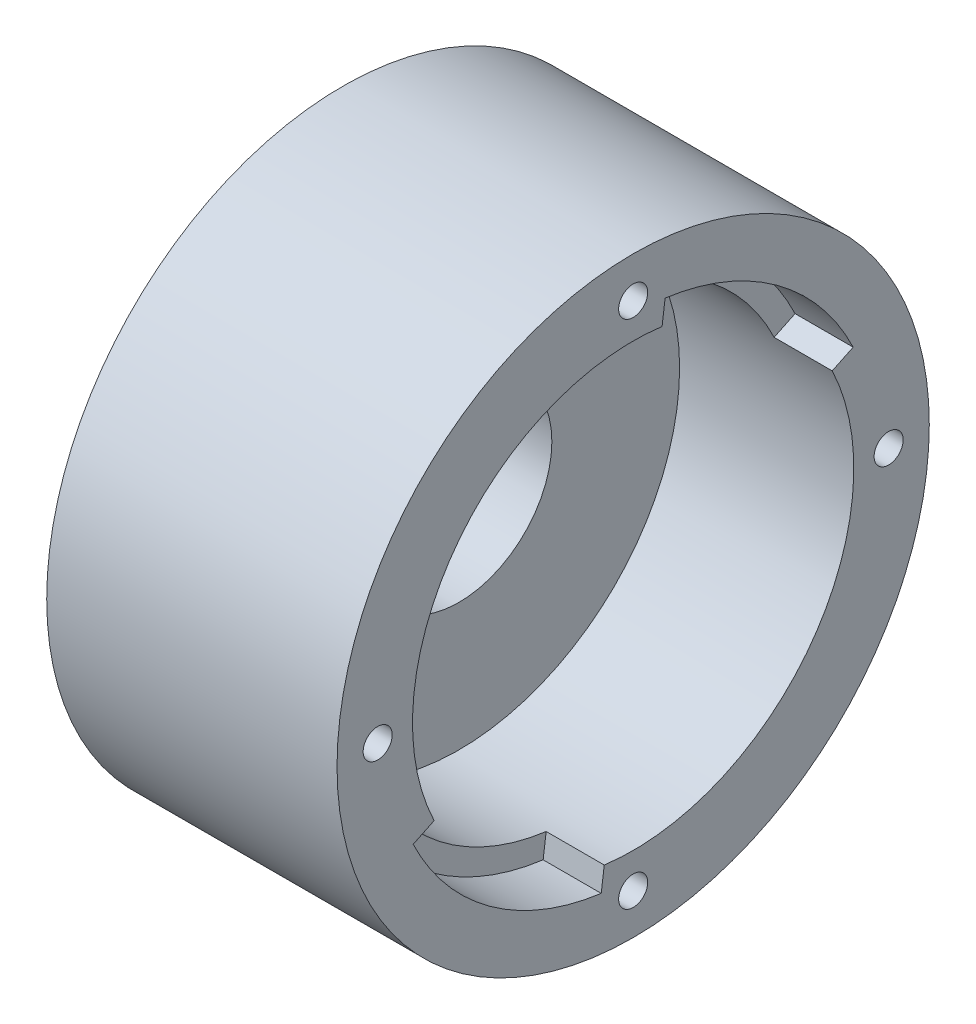
ISO-10303-21;
HEADER;
FILE_DESCRIPTION(('STEP AP214'),'2;1');
FILE_NAME('part.step','',(''),(''),'','','');
FILE_SCHEMA(('AUTOMOTIVE_DESIGN { 1 0 10303 214 1 1 1 1 }'));
ENDSEC;
DATA;
#1=APPLICATION_CONTEXT('core data for automotive mechanical design processes');
#2=APPLICATION_PROTOCOL_DEFINITION('international standard','automotive_design',2000,#1);
#3=PRODUCT_CONTEXT('',#1,'mechanical');
#4=PRODUCT('Part','Part','',(#3));
#5=PRODUCT_RELATED_PRODUCT_CATEGORY('part','',(#4));
#6=PRODUCT_DEFINITION_FORMATION('','',#4);
#7=PRODUCT_DEFINITION_CONTEXT('part definition',#1,'design');
#8=PRODUCT_DEFINITION('design','',#6,#7);
#9=PRODUCT_DEFINITION_SHAPE('','',#8);
#10=(LENGTH_UNIT() NAMED_UNIT(*) SI_UNIT(.MILLI.,.METRE.));
#11=(NAMED_UNIT(*) PLANE_ANGLE_UNIT() SI_UNIT($,.RADIAN.));
#12=(NAMED_UNIT(*) SI_UNIT($,.STERADIAN.) SOLID_ANGLE_UNIT());
#13=UNCERTAINTY_MEASURE_WITH_UNIT(LENGTH_MEASURE(1.E-05),#10,'distance_accuracy_value','');
#14=(GEOMETRIC_REPRESENTATION_CONTEXT(3) GLOBAL_UNCERTAINTY_ASSIGNED_CONTEXT((#13)) GLOBAL_UNIT_ASSIGNED_CONTEXT((#10,
#11,#12)) REPRESENTATION_CONTEXT('',''));
#15=CARTESIAN_POINT('',(0.,0.,0.));
#16=DIRECTION('',(0.,0.,1.));
#17=DIRECTION('',(1.,0.,0.));
#18=AXIS2_PLACEMENT_3D('',#15,#16,#17);
#19=CARTESIAN_POINT('',(163.98,0.,0.));
#20=DIRECTION('',(1.,0.,0.));
#21=DIRECTION('',(0.,0.,-1.));
#22=AXIS2_PLACEMENT_3D('',#19,#20,#21);
#23=CYLINDRICAL_SURFACE('',#22,16.);
#24=CARTESIAN_POINT('',(163.98,0.,0.));
#25=DIRECTION('',(-1.,0.,0.));
#26=DIRECTION('',(0.,0.,1.));
#27=AXIS2_PLACEMENT_3D('',#24,#25,#26);
#28=CIRCLE('',#27,16.);
#29=CARTESIAN_POINT('',(163.98,0.,16.));
#30=VERTEX_POINT('',#29);
#31=EDGE_CURVE('E276',#30,#30,#28,.T.);
#32=ORIENTED_EDGE('',*,*,#31,.T.);
#33=EDGE_LOOP('',(#32));
#34=FACE_BOUND('',#33,.T.);
#35=CARTESIAN_POINT('',(183.98,0.,0.));
#36=DIRECTION('',(1.,0.,0.));
#37=DIRECTION('',(0.,0.,-1.));
#38=AXIS2_PLACEMENT_3D('',#35,#36,#37);
#39=CIRCLE('',#38,16.);
#40=CARTESIAN_POINT('',(183.98,0.,-16.));
#41=VERTEX_POINT('',#40);
#42=EDGE_CURVE('E45',#41,#41,#39,.T.);
#43=ORIENTED_EDGE('',*,*,#42,.T.);
#44=EDGE_LOOP('',(#43));
#45=FACE_BOUND('',#44,.T.);
#46=ADVANCED_FACE('F41',(#34,#45),#23,.F.);
#47=CARTESIAN_POINT('',(203.98,0.,0.));
#48=DIRECTION('',(1.,0.,0.));
#49=DIRECTION('',(0.,0.,-1.));
#50=AXIS2_PLACEMENT_3D('',#47,#48,#49);
#51=CYLINDRICAL_SURFACE('',#50,42.);
#52=CARTESIAN_POINT('',(213.98,0.,0.));
#53=DIRECTION('',(1.,0.,0.));
#54=DIRECTION('',(0.,0.,1.));
#55=AXIS2_PLACEMENT_3D('',#52,#53,#54);
#56=CIRCLE('',#55,42.);
#57=CARTESIAN_POINT('',(213.98,18.1283380226099,-37.886189575332));
#58=VERTEX_POINT('',#57);
#59=CARTESIAN_POINT('',(213.98,41.6379057132109,-5.50316343731083));
#60=VERTEX_POINT('',#59);
#61=EDGE_CURVE('E114',#58,#60,#56,.T.);
#62=ORIENTED_EDGE('',*,*,#61,.T.);
#63=DIRECTION('',(1.,0.,0.));
#64=VECTOR('',#63,1.);
#65=CARTESIAN_POINT('',(203.98,41.6379057132109,-5.50316343731083));
#66=LINE('',#65,#64);
#67=CARTESIAN_POINT('',(203.98,41.6379057132109,-5.50316343731083));
#68=VERTEX_POINT('',#67);
#69=EDGE_CURVE('E109',#68,#60,#66,.T.);
#70=ORIENTED_EDGE('',*,*,#69,.F.);
#71=CARTESIAN_POINT('',(203.98,0.,0.));
#72=DIRECTION('',(1.,0.,0.));
#73=DIRECTION('',(0.,0.,-1.));
#74=AXIS2_PLACEMENT_3D('',#71,#72,#73);
#75=CIRCLE('',#74,42.);
#76=CARTESIAN_POINT('',(203.98,18.1283380226099,-37.886189575332));
#77=VERTEX_POINT('',#76);
#78=EDGE_CURVE('E111',#77,#68,#75,.T.);
#79=ORIENTED_EDGE('',*,*,#78,.F.);
#80=DIRECTION('',(1.,0.,0.));
#81=VECTOR('',#80,1.);
#82=CARTESIAN_POINT('',(203.98,18.1283380226099,-37.886189575332));
#83=LINE('',#82,#81);
#84=EDGE_CURVE('E150',#77,#58,#83,.T.);
#85=ORIENTED_EDGE('',*,*,#84,.T.);
#86=EDGE_LOOP('',(#62,#70,#79,#85));
#87=FACE_BOUND('',#86,.T.);
#88=ADVANCED_FACE('F110',(#87),#51,.F.);
#89=CARTESIAN_POINT('',(203.98,0.,0.));
#90=DIRECTION('',(1.,0.,0.));
#91=DIRECTION('',(0.,0.,-1.));
#92=AXIS2_PLACEMENT_3D('',#89,#90,#91);
#93=CYLINDRICAL_SURFACE('',#92,42.);
#94=CARTESIAN_POINT('',(213.98,0.,0.));
#95=DIRECTION('',(1.,0.,0.));
#96=DIRECTION('',(0.,0.,1.));
#97=AXIS2_PLACEMENT_3D('',#94,#95,#96);
#98=CIRCLE('',#97,42.);
#99=CARTESIAN_POINT('',(213.98,-18.1283380226064,37.8861895753337));
#100=VERTEX_POINT('',#99);
#101=CARTESIAN_POINT('',(213.98,-41.6379057132105,5.50316343731468));
#102=VERTEX_POINT('',#101);
#103=EDGE_CURVE('E162',#100,#102,#98,.T.);
#104=ORIENTED_EDGE('',*,*,#103,.T.);
#105=DIRECTION('',(1.,0.,0.));
#106=VECTOR('',#105,1.);
#107=CARTESIAN_POINT('',(203.98,-41.6379057132105,5.50316343731468));
#108=LINE('',#107,#106);
#109=CARTESIAN_POINT('',(203.98,-41.6379057132105,5.50316343731468));
#110=VERTEX_POINT('',#109);
#111=EDGE_CURVE('E172',#110,#102,#108,.T.);
#112=ORIENTED_EDGE('',*,*,#111,.F.);
#113=CARTESIAN_POINT('',(203.98,0.,0.));
#114=DIRECTION('',(1.,0.,0.));
#115=DIRECTION('',(0.,0.,-1.));
#116=AXIS2_PLACEMENT_3D('',#113,#114,#115);
#117=CIRCLE('',#116,42.);
#118=CARTESIAN_POINT('',(203.98,-18.1283380226064,37.8861895753337));
#119=VERTEX_POINT('',#118);
#120=EDGE_CURVE('E159',#119,#110,#117,.T.);
#121=ORIENTED_EDGE('',*,*,#120,.F.);
#122=DIRECTION('',(1.,0.,0.));
#123=VECTOR('',#122,1.);
#124=CARTESIAN_POINT('',(203.98,-18.1283380226064,37.8861895753337));
#125=LINE('',#124,#123);
#126=EDGE_CURVE('E146',#119,#100,#125,.T.);
#127=ORIENTED_EDGE('',*,*,#126,.T.);
#128=EDGE_LOOP('',(#104,#112,#121,#127));
#129=FACE_BOUND('',#128,.T.);
#130=ADVANCED_FACE('F257',(#129),#93,.F.);
#131=CARTESIAN_POINT('',(203.98,-37.6723908833809,4.9790526337609));
#132=DIRECTION('',(0.,-0.131027700888445,-0.991378707457392));
#133=DIRECTION('',(0.,0.991378707457392,-0.131027700888445));
#134=AXIS2_PLACEMENT_3D('',#131,#132,#133);
#135=PLANE('',#134);
#136=DIRECTION('',(0.,0.991378707457392,-0.131027700888445));
#137=VECTOR('',#136,1.);
#138=CARTESIAN_POINT('',(213.98,-37.6723908833809,4.9790526337609));
#139=LINE('',#138,#137);
#140=CARTESIAN_POINT('',(213.98,-37.6723908833809,4.9790526337609));
#141=VERTEX_POINT('',#140);
#142=EDGE_CURVE('E173',#102,#141,#139,.T.);
#143=ORIENTED_EDGE('',*,*,#142,.T.);
#144=DIRECTION('',(1.,0.,0.));
#145=VECTOR('',#144,1.);
#146=CARTESIAN_POINT('',(203.98,-37.6723908833809,4.9790526337609));
#147=LINE('',#146,#145);
#148=CARTESIAN_POINT('',(203.98,-37.6723908833809,4.9790526337609));
#149=VERTEX_POINT('',#148);
#150=EDGE_CURVE('E187',#149,#141,#147,.T.);
#151=ORIENTED_EDGE('',*,*,#150,.F.);
#152=DIRECTION('',(0.,0.991378707457392,-0.131027700888445));
#153=VECTOR('',#152,1.);
#154=CARTESIAN_POINT('',(203.98,-37.6723908833809,4.9790526337609));
#155=LINE('',#154,#153);
#156=EDGE_CURVE('E66',#110,#149,#155,.T.);
#157=ORIENTED_EDGE('',*,*,#156,.F.);
#158=ORIENTED_EDGE('',*,*,#111,.T.);
#159=EDGE_LOOP('',(#143,#151,#157,#158));
#160=FACE_BOUND('',#159,.T.);
#161=ADVANCED_FACE('F317',(#160),#135,.F.);
#162=CARTESIAN_POINT('',(203.98,0.,0.));
#163=DIRECTION('',(1.,0.,0.));
#164=DIRECTION('',(0.,0.,-1.));
#165=AXIS2_PLACEMENT_3D('',#162,#163,#164);
#166=PLANE('',#165);
#167=ORIENTED_EDGE('',*,*,#120,.T.);
#168=ORIENTED_EDGE('',*,*,#156,.T.);
#169=CARTESIAN_POINT('',(203.98,0.,0.));
#170=DIRECTION('',(-1.,0.,0.));
#171=DIRECTION('',(0.,0.,-1.));
#172=AXIS2_PLACEMENT_3D('',#169,#170,#171);
#173=CIRCLE('',#172,38.);
#174=CARTESIAN_POINT('',(203.98,-16.401829639501,34.2779810443496));
#175=VERTEX_POINT('',#174);
#176=EDGE_CURVE('E165',#149,#175,#173,.T.);
#177=ORIENTED_EDGE('',*,*,#176,.T.);
#178=DIRECTION('',(0.,-0.431627095776342,0.90205213274604));
#179=VECTOR('',#178,1.);
#180=CARTESIAN_POINT('',(203.98,-16.401829639501,34.2779810443496));
#181=LINE('',#180,#179);
#182=EDGE_CURVE('E168',#175,#119,#181,.T.);
#183=ORIENTED_EDGE('',*,*,#182,.T.);
#184=EDGE_LOOP('',(#167,#168,#177,#183));
#185=FACE_BOUND('',#184,.T.);
#186=ADVANCED_FACE('F233',(#185),#166,.T.);
#187=CARTESIAN_POINT('',(203.98,-16.401829639501,34.2779810443496));
#188=DIRECTION('',(0.,0.902052132746041,0.431627095776342));
#189=DIRECTION('',(0.,-0.431627095776342,0.902052132746041));
#190=AXIS2_PLACEMENT_3D('',#187,#188,#189);
#191=PLANE('',#190);
#192=DIRECTION('',(0.,-0.431627095776342,0.90205213274604));
#193=VECTOR('',#192,1.);
#194=CARTESIAN_POINT('',(213.98,-16.401829639501,34.2779810443496));
#195=LINE('',#194,#193);
#196=CARTESIAN_POINT('',(213.98,-16.401829639501,34.2779810443496));
#197=VERTEX_POINT('',#196);
#198=EDGE_CURVE('E176',#197,#100,#195,.T.);
#199=ORIENTED_EDGE('',*,*,#198,.T.);
#200=ORIENTED_EDGE('',*,*,#126,.F.);
#201=ORIENTED_EDGE('',*,*,#182,.F.);
#202=DIRECTION('',(1.,0.,0.));
#203=VECTOR('',#202,1.);
#204=CARTESIAN_POINT('',(203.98,-16.401829639501,34.2779810443496));
#205=LINE('',#204,#203);
#206=EDGE_CURVE('E184',#175,#197,#205,.T.);
#207=ORIENTED_EDGE('',*,*,#206,.T.);
#208=EDGE_LOOP('',(#199,#200,#201,#207));
#209=FACE_BOUND('',#208,.T.);
#210=ADVANCED_FACE('F231',(#209),#191,.F.);
#211=CARTESIAN_POINT('',(213.98,0.,0.));
#212=DIRECTION('',(1.,0.,0.));
#213=DIRECTION('',(0.,0.,-1.));
#214=AXIS2_PLACEMENT_3D('',#211,#212,#213);
#215=PLANE('',#214);
#216=DIRECTION('',(0.,0.431627095776426,-0.902052132746));
#217=VECTOR('',#216,1.);
#218=CARTESIAN_POINT('',(213.98,16.4018296395042,-34.277981044348));
#219=LINE('',#218,#217);
#220=CARTESIAN_POINT('',(213.98,16.4018296395042,-34.277981044348));
#221=VERTEX_POINT('',#220);
#222=EDGE_CURVE('E133',#221,#58,#219,.T.);
#223=ORIENTED_EDGE('',*,*,#222,.F.);
#224=CARTESIAN_POINT('',(213.98,0.,0.));
#225=DIRECTION('',(1.,0.,0.));
#226=DIRECTION('',(0.,0.,-1.));
#227=AXIS2_PLACEMENT_3D('',#224,#225,#226);
#228=CIRCLE('',#227,38.);
#229=EDGE_CURVE('E198',#141,#221,#228,.T.);
#230=ORIENTED_EDGE('',*,*,#229,.F.);
#231=ORIENTED_EDGE('',*,*,#142,.F.);
#232=ORIENTED_EDGE('',*,*,#103,.F.);
#233=ORIENTED_EDGE('',*,*,#198,.F.);
#234=CARTESIAN_POINT('',(213.98,37.6723908833813,-4.97905263375742));
#235=VERTEX_POINT('',#234);
#236=EDGE_CURVE('E51',#235,#197,#228,.T.);
#237=ORIENTED_EDGE('',*,*,#236,.F.);
#238=DIRECTION('',(0.,-0.991378707457404,0.131027700888353));
#239=VECTOR('',#238,1.);
#240=CARTESIAN_POINT('',(213.98,37.6723908833813,-4.97905263375742));
#241=LINE('',#240,#239);
#242=EDGE_CURVE('E143',#60,#235,#241,.T.);
#243=ORIENTED_EDGE('',*,*,#242,.F.);
#244=ORIENTED_EDGE('',*,*,#61,.F.);
#245=EDGE_LOOP('',(#223,#230,#231,#232,#233,#237,#243,#244));
#246=FACE_BOUND('',#245,.T.);
#247=CARTESIAN_POINT('',(213.98,44.,0.));
#248=DIRECTION('',(1.,0.,0.));
#249=DIRECTION('',(0.,0.,-1.));
#250=AXIS2_PLACEMENT_3D('',#247,#248,#249);
#251=CIRCLE('',#250,2.50000000000249);
#252=CARTESIAN_POINT('',(213.98,44.,-2.50000000000249));
#253=VERTEX_POINT('',#252);
#254=EDGE_CURVE('E194',#253,#253,#251,.F.);
#255=ORIENTED_EDGE('',*,*,#254,.T.);
#256=EDGE_LOOP('',(#255));
#257=FACE_BOUND('',#256,.T.);
#258=CARTESIAN_POINT('',(213.98,1.15794220585168E-12,44.0000000000012));
#259=DIRECTION('',(1.,0.,0.));
#260=DIRECTION('',(0.,0.,-1.));
#261=AXIS2_PLACEMENT_3D('',#258,#259,#260);
#262=CIRCLE('',#261,2.50000000000249);
#263=CARTESIAN_POINT('',(213.98,1.15794220585168E-12,41.4999999999987));
#264=VERTEX_POINT('',#263);
#265=EDGE_CURVE('E199',#264,#264,#262,.F.);
#266=ORIENTED_EDGE('',*,*,#265,.T.);
#267=EDGE_LOOP('',(#266));
#268=FACE_BOUND('',#267,.T.);
#269=CARTESIAN_POINT('',(213.98,-44.,2.31588441170336E-12));
#270=DIRECTION('',(1.,0.,0.));
#271=DIRECTION('',(0.,0.,-1.));
#272=AXIS2_PLACEMENT_3D('',#269,#270,#271);
#273=CIRCLE('',#272,2.50000000000249);
#274=CARTESIAN_POINT('',(213.98,-44.,-2.50000000000018));
#275=VERTEX_POINT('',#274);
#276=EDGE_CURVE('E203',#275,#275,#273,.F.);
#277=ORIENTED_EDGE('',*,*,#276,.T.);
#278=EDGE_LOOP('',(#277));
#279=FACE_BOUND('',#278,.T.);
#280=CARTESIAN_POINT('',(213.98,-1.16333065176793E-12,-43.9999999999988));
#281=DIRECTION('',(1.,0.,0.));
#282=DIRECTION('',(0.,0.,-1.));
#283=AXIS2_PLACEMENT_3D('',#280,#281,#282);
#284=CIRCLE('',#283,2.50000000000248);
#285=CARTESIAN_POINT('',(213.98,-1.16333065176793E-12,-46.5000000000013));
#286=VERTEX_POINT('',#285);
#287=EDGE_CURVE('E153',#286,#286,#284,.F.);
#288=ORIENTED_EDGE('',*,*,#287,.T.);
#289=EDGE_LOOP('',(#288));
#290=FACE_BOUND('',#289,.T.);
#291=CARTESIAN_POINT('',(213.98,0.,0.));
#292=DIRECTION('',(1.,0.,0.));
#293=DIRECTION('',(0.,0.,-1.));
#294=AXIS2_PLACEMENT_3D('',#291,#292,#293);
#295=CIRCLE('',#294,51.);
#296=CARTESIAN_POINT('',(213.98,0.,-51.));
#297=VERTEX_POINT('',#296);
#298=EDGE_CURVE('E11',#297,#297,#295,.T.);
#299=ORIENTED_EDGE('',*,*,#298,.T.);
#300=EDGE_LOOP('',(#299));
#301=FACE_BOUND('',#300,.T.);
#302=ADVANCED_FACE('F225',(#246,#257,#268,#279,#290,#301),#215,.T.);
#303=CARTESIAN_POINT('',(221.051067811873,44.,0.));
#304=DIRECTION('',(-1.,0.,0.));
#305=DIRECTION('',(0.,0.,1.));
#306=AXIS2_PLACEMENT_3D('',#303,#304,#305);
#307=CYLINDRICAL_SURFACE('',#306,2.50000000000249);
#308=ORIENTED_EDGE('',*,*,#254,.F.);
#309=EDGE_LOOP('',(#308));
#310=FACE_BOUND('',#309,.T.);
#311=CARTESIAN_POINT('',(163.98,44.,0.));
#312=DIRECTION('',(-1.,0.,0.));
#313=DIRECTION('',(0.,0.,1.));
#314=AXIS2_PLACEMENT_3D('',#311,#312,#313);
#315=CIRCLE('',#314,2.50000000000249);
#316=CARTESIAN_POINT('',(163.98,44.,2.50000000000249));
#317=VERTEX_POINT('',#316);
#318=EDGE_CURVE('E286',#317,#317,#315,.F.);
#319=ORIENTED_EDGE('',*,*,#318,.F.);
#320=EDGE_LOOP('',(#319));
#321=FACE_BOUND('',#320,.T.);
#322=ADVANCED_FACE('F304',(#310,#321),#307,.F.);
#323=CARTESIAN_POINT('',(221.051067811873,1.15794220585168E-12,44.0000000000012));
#324=DIRECTION('',(-1.,0.,0.));
#325=DIRECTION('',(0.,0.,1.));
#326=AXIS2_PLACEMENT_3D('',#323,#324,#325);
#327=CYLINDRICAL_SURFACE('',#326,2.50000000000249);
#328=ORIENTED_EDGE('',*,*,#265,.F.);
#329=EDGE_LOOP('',(#328));
#330=FACE_BOUND('',#329,.T.);
#331=CARTESIAN_POINT('',(163.98,-1.24786099197965E-12,43.9999999999988));
#332=DIRECTION('',(-1.,0.,0.));
#333=DIRECTION('',(0.,0.,1.));
#334=AXIS2_PLACEMENT_3D('',#331,#332,#333);
#335=CIRCLE('',#334,2.50000000000449);
#336=CARTESIAN_POINT('',(163.98,-1.24786099197965E-12,46.5000000000032));
#337=VERTEX_POINT('',#336);
#338=EDGE_CURVE('E287',#337,#337,#335,.F.);
#339=ORIENTED_EDGE('',*,*,#338,.F.);
#340=EDGE_LOOP('',(#339));
#341=FACE_BOUND('',#340,.T.);
#342=ADVANCED_FACE('F305',(#330,#341),#327,.F.);
#343=CARTESIAN_POINT('',(221.051067811873,-44.,2.31588441170336E-12));
#344=DIRECTION('',(-1.,0.,0.));
#345=DIRECTION('',(0.,0.,1.));
#346=AXIS2_PLACEMENT_3D('',#343,#344,#345);
#347=CYLINDRICAL_SURFACE('',#346,2.50000000000249);
#348=ORIENTED_EDGE('',*,*,#276,.F.);
#349=EDGE_LOOP('',(#348));
#350=FACE_BOUND('',#349,.T.);
#351=CARTESIAN_POINT('',(163.98,-44.,-2.48494509212681E-12));
#352=DIRECTION('',(-1.,0.,0.));
#353=DIRECTION('',(0.,0.,1.));
#354=AXIS2_PLACEMENT_3D('',#351,#352,#353);
#355=CIRCLE('',#354,2.50000000000516);
#356=CARTESIAN_POINT('',(163.98,-44.,2.50000000000268));
#357=VERTEX_POINT('',#356);
#358=EDGE_CURVE('E291',#357,#357,#355,.F.);
#359=ORIENTED_EDGE('',*,*,#358,.F.);
#360=EDGE_LOOP('',(#359));
#361=FACE_BOUND('',#360,.T.);
#362=ADVANCED_FACE('F311',(#350,#361),#347,.F.);
#363=CARTESIAN_POINT('',(221.051067811873,-1.16333065176793E-12,-43.9999999999988));
#364=DIRECTION('',(-1.,0.,0.));
#365=DIRECTION('',(0.,0.,1.));
#366=AXIS2_PLACEMENT_3D('',#363,#364,#365);
#367=CYLINDRICAL_SURFACE('',#366,2.50000000000248);
#368=ORIENTED_EDGE('',*,*,#287,.F.);
#369=EDGE_LOOP('',(#368));
#370=FACE_BOUND('',#369,.T.);
#371=CARTESIAN_POINT('',(163.98,1.2424725460634E-12,-44.0000000000012));
#372=DIRECTION('',(-1.,0.,0.));
#373=DIRECTION('',(0.,0.,1.));
#374=AXIS2_PLACEMENT_3D('',#371,#372,#373);
#375=CIRCLE('',#374,2.50000000000347);
#376=CARTESIAN_POINT('',(163.98,1.2424725460634E-12,-41.4999999999978));
#377=VERTEX_POINT('',#376);
#378=EDGE_CURVE('E295',#377,#377,#375,.F.);
#379=ORIENTED_EDGE('',*,*,#378,.F.);
#380=EDGE_LOOP('',(#379));
#381=FACE_BOUND('',#380,.T.);
#382=ADVANCED_FACE('F322',(#370,#381),#367,.F.);
#383=CARTESIAN_POINT('',(203.98,37.6723908833813,-4.97905263375742));
#384=DIRECTION('',(0.,0.131027700888353,0.991378707457404));
#385=DIRECTION('',(0.,-0.991378707457404,0.131027700888353));
#386=AXIS2_PLACEMENT_3D('',#383,#384,#385);
#387=PLANE('',#386);
#388=ORIENTED_EDGE('',*,*,#242,.T.);
#389=DIRECTION('',(1.,0.,0.));
#390=VECTOR('',#389,1.);
#391=CARTESIAN_POINT('',(203.98,37.6723908833813,-4.97905263375742));
#392=LINE('',#391,#390);
#393=CARTESIAN_POINT('',(203.98,37.6723908833813,-4.97905263375742));
#394=VERTEX_POINT('',#393);
#395=EDGE_CURVE('E118',#394,#235,#392,.T.);
#396=ORIENTED_EDGE('',*,*,#395,.F.);
#397=DIRECTION('',(0.,-0.991378707457404,0.131027700888353));
#398=VECTOR('',#397,1.);
#399=CARTESIAN_POINT('',(203.98,37.6723908833813,-4.97905263375742));
#400=LINE('',#399,#398);
#401=EDGE_CURVE('E58',#68,#394,#400,.T.);
#402=ORIENTED_EDGE('',*,*,#401,.F.);
#403=ORIENTED_EDGE('',*,*,#69,.T.);
#404=EDGE_LOOP('',(#388,#396,#402,#403));
#405=FACE_BOUND('',#404,.T.);
#406=ADVANCED_FACE('F121',(#405),#387,.F.);
#407=CARTESIAN_POINT('',(203.98,0.,0.));
#408=DIRECTION('',(1.,0.,0.));
#409=DIRECTION('',(0.,0.,-1.));
#410=AXIS2_PLACEMENT_3D('',#407,#408,#409);
#411=PLANE('',#410);
#412=ORIENTED_EDGE('',*,*,#78,.T.);
#413=ORIENTED_EDGE('',*,*,#401,.T.);
#414=CARTESIAN_POINT('',(203.98,0.,0.));
#415=DIRECTION('',(-1.,0.,0.));
#416=DIRECTION('',(0.,0.,-1.));
#417=AXIS2_PLACEMENT_3D('',#414,#415,#416);
#418=CIRCLE('',#417,38.);
#419=CARTESIAN_POINT('',(203.98,16.4018296395042,-34.277981044348));
#420=VERTEX_POINT('',#419);
#421=EDGE_CURVE('E125',#394,#420,#418,.T.);
#422=ORIENTED_EDGE('',*,*,#421,.T.);
#423=DIRECTION('',(0.,0.431627095776426,-0.902052132746));
#424=VECTOR('',#423,1.);
#425=CARTESIAN_POINT('',(203.98,16.4018296395042,-34.277981044348));
#426=LINE('',#425,#424);
#427=EDGE_CURVE('E119',#420,#77,#426,.T.);
#428=ORIENTED_EDGE('',*,*,#427,.T.);
#429=EDGE_LOOP('',(#412,#413,#422,#428));
#430=FACE_BOUND('',#429,.T.);
#431=ADVANCED_FACE('F128',(#430),#411,.T.);
#432=CARTESIAN_POINT('',(203.98,16.4018296395042,-34.277981044348));
#433=DIRECTION('',(0.,-0.902052132746,-0.431627095776426));
#434=DIRECTION('',(0.,0.431627095776426,-0.902052132746));
#435=AXIS2_PLACEMENT_3D('',#432,#433,#434);
#436=PLANE('',#435);
#437=ORIENTED_EDGE('',*,*,#222,.T.);
#438=ORIENTED_EDGE('',*,*,#84,.F.);
#439=ORIENTED_EDGE('',*,*,#427,.F.);
#440=DIRECTION('',(1.,0.,0.));
#441=VECTOR('',#440,1.);
#442=CARTESIAN_POINT('',(203.98,16.4018296395042,-34.277981044348));
#443=LINE('',#442,#441);
#444=EDGE_CURVE('E154',#420,#221,#443,.T.);
#445=ORIENTED_EDGE('',*,*,#444,.T.);
#446=EDGE_LOOP('',(#437,#438,#439,#445));
#447=FACE_BOUND('',#446,.T.);
#448=ADVANCED_FACE('F236',(#447),#436,.F.);
#449=CARTESIAN_POINT('',(213.98,0.,0.));
#450=DIRECTION('',(-1.,0.,0.));
#451=DIRECTION('',(0.,0.,1.));
#452=AXIS2_PLACEMENT_3D('',#449,#450,#451);
#453=CYLINDRICAL_SURFACE('',#452,38.);
#454=ORIENTED_EDGE('',*,*,#444,.F.);
#455=ORIENTED_EDGE('',*,*,#421,.F.);
#456=ORIENTED_EDGE('',*,*,#395,.T.);
#457=ORIENTED_EDGE('',*,*,#236,.T.);
#458=ORIENTED_EDGE('',*,*,#206,.F.);
#459=ORIENTED_EDGE('',*,*,#176,.F.);
#460=ORIENTED_EDGE('',*,*,#150,.T.);
#461=ORIENTED_EDGE('',*,*,#229,.T.);
#462=EDGE_LOOP('',(#454,#455,#456,#457,#458,#459,#460,#461));
#463=FACE_BOUND('',#462,.T.);
#464=CARTESIAN_POINT('',(183.98,0.,0.));
#465=DIRECTION('',(1.,0.,0.));
#466=DIRECTION('',(0.,0.,-1.));
#467=AXIS2_PLACEMENT_3D('',#464,#465,#466);
#468=CIRCLE('',#467,38.);
#469=CARTESIAN_POINT('',(183.98,0.,-38.));
#470=VERTEX_POINT('',#469);
#471=EDGE_CURVE('E281',#470,#470,#468,.T.);
#472=ORIENTED_EDGE('',*,*,#471,.F.);
#473=EDGE_LOOP('',(#472));
#474=FACE_BOUND('',#473,.T.);
#475=ADVANCED_FACE('F219',(#463,#474),#453,.F.);
#476=CARTESIAN_POINT('',(213.98,0.,0.));
#477=DIRECTION('',(-1.,0.,0.));
#478=DIRECTION('',(0.,0.,1.));
#479=AXIS2_PLACEMENT_3D('',#476,#477,#478);
#480=CYLINDRICAL_SURFACE('',#479,51.);
#481=ORIENTED_EDGE('',*,*,#298,.F.);
#482=EDGE_LOOP('',(#481));
#483=FACE_BOUND('',#482,.T.);
#484=CARTESIAN_POINT('',(163.98,0.,0.));
#485=DIRECTION('',(-1.,0.,0.));
#486=DIRECTION('',(0.,0.,1.));
#487=AXIS2_PLACEMENT_3D('',#484,#485,#486);
#488=CIRCLE('',#487,51.);
#489=CARTESIAN_POINT('',(163.98,0.,51.));
#490=VERTEX_POINT('',#489);
#491=EDGE_CURVE('E136',#490,#490,#488,.T.);
#492=ORIENTED_EDGE('',*,*,#491,.F.);
#493=EDGE_LOOP('',(#492));
#494=FACE_BOUND('',#493,.T.);
#495=ADVANCED_FACE('F43',(#483,#494),#480,.T.);
#496=CARTESIAN_POINT('',(163.98,0.,0.));
#497=DIRECTION('',(-1.,0.,0.));
#498=DIRECTION('',(0.,0.,1.));
#499=AXIS2_PLACEMENT_3D('',#496,#497,#498);
#500=PLANE('',#499);
#501=ORIENTED_EDGE('',*,*,#318,.T.);
#502=EDGE_LOOP('',(#501));
#503=FACE_BOUND('',#502,.T.);
#504=ORIENTED_EDGE('',*,*,#378,.T.);
#505=EDGE_LOOP('',(#504));
#506=FACE_BOUND('',#505,.T.);
#507=ORIENTED_EDGE('',*,*,#358,.T.);
#508=EDGE_LOOP('',(#507));
#509=FACE_BOUND('',#508,.T.);
#510=ORIENTED_EDGE('',*,*,#338,.T.);
#511=EDGE_LOOP('',(#510));
#512=FACE_BOUND('',#511,.T.);
#513=ORIENTED_EDGE('',*,*,#491,.T.);
#514=EDGE_LOOP('',(#513));
#515=FACE_BOUND('',#514,.T.);
#516=ORIENTED_EDGE('',*,*,#31,.F.);
#517=EDGE_LOOP('',(#516));
#518=FACE_BOUND('',#517,.T.);
#519=ADVANCED_FACE('F258',(#503,#506,#509,#512,#515,#518),#500,.T.);
#520=CARTESIAN_POINT('',(183.98,0.,0.));
#521=DIRECTION('',(1.,0.,0.));
#522=DIRECTION('',(0.,0.,-1.));
#523=AXIS2_PLACEMENT_3D('',#520,#521,#522);
#524=PLANE('',#523);
#525=ORIENTED_EDGE('',*,*,#42,.F.);
#526=EDGE_LOOP('',(#525));
#527=FACE_BOUND('',#526,.T.);
#528=ORIENTED_EDGE('',*,*,#471,.T.);
#529=EDGE_LOOP('',(#528));
#530=FACE_BOUND('',#529,.T.);
#531=ADVANCED_FACE('F268',(#527,#530),#524,.T.);
#532=CLOSED_SHELL('',(#46,#88,#130,#161,#186,#210,#302,#322,#342,#362,#382,#406,#431,#448,#475,
#495,#519,#531));
#533=MANIFOLD_SOLID_BREP('B2',#532);
#534=ADVANCED_BREP_SHAPE_REPRESENTATION('',(#18,#533),#14);
#535=SHAPE_DEFINITION_REPRESENTATION(#9,#534);
ENDSEC;
END-ISO-10303-21;
